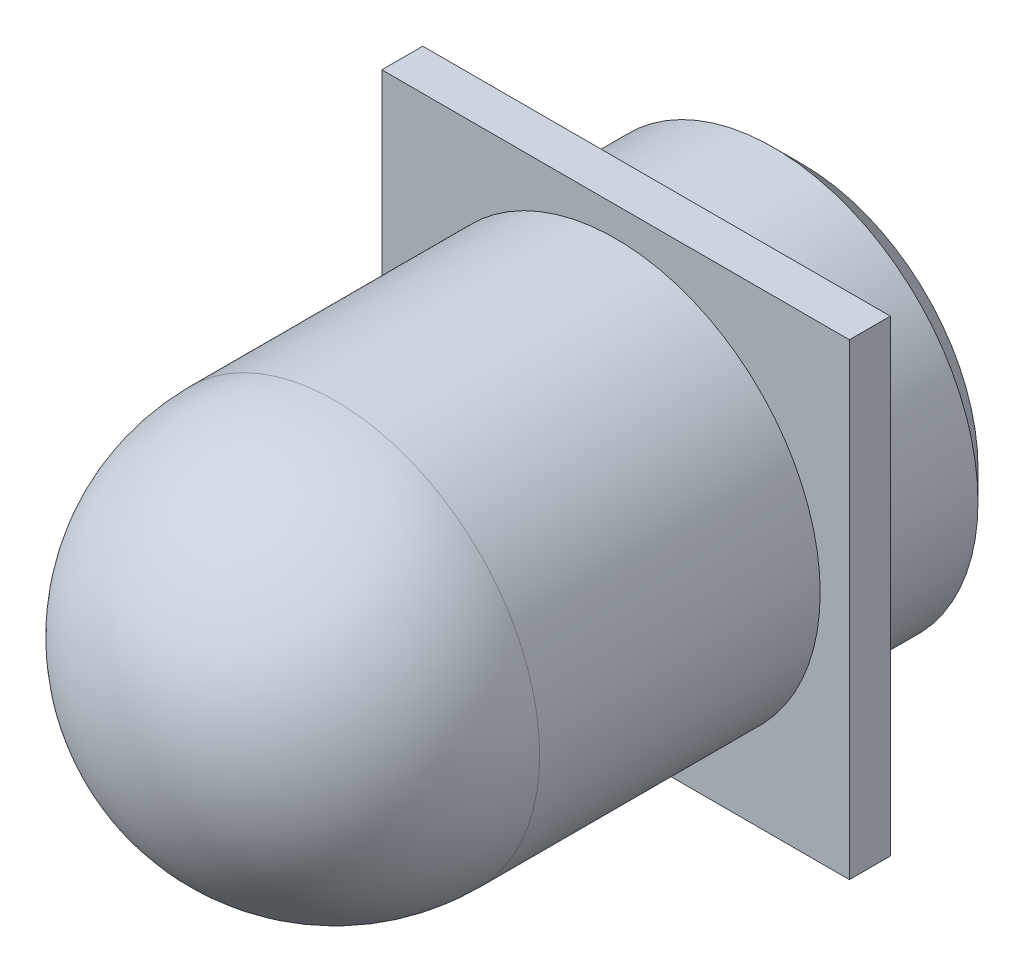
ISO-10303-21;
HEADER;
FILE_DESCRIPTION(('STEP AP214'),'2;1');
FILE_NAME('part.step','',(''),(''),'','','');
FILE_SCHEMA(('AUTOMOTIVE_DESIGN { 1 0 10303 214 1 1 1 1 }'));
ENDSEC;
DATA;
#1=APPLICATION_CONTEXT('core data for automotive mechanical design processes');
#2=APPLICATION_PROTOCOL_DEFINITION('international standard','automotive_design',2000,#1);
#3=PRODUCT_CONTEXT('',#1,'mechanical');
#4=PRODUCT('Part','Part','',(#3));
#5=PRODUCT_RELATED_PRODUCT_CATEGORY('part','',(#4));
#6=PRODUCT_DEFINITION_FORMATION('','',#4);
#7=PRODUCT_DEFINITION_CONTEXT('part definition',#1,'design');
#8=PRODUCT_DEFINITION('design','',#6,#7);
#9=PRODUCT_DEFINITION_SHAPE('','',#8);
#10=(LENGTH_UNIT() NAMED_UNIT(*) SI_UNIT(.MILLI.,.METRE.));
#11=(NAMED_UNIT(*) PLANE_ANGLE_UNIT() SI_UNIT($,.RADIAN.));
#12=(NAMED_UNIT(*) SI_UNIT($,.STERADIAN.) SOLID_ANGLE_UNIT());
#13=UNCERTAINTY_MEASURE_WITH_UNIT(LENGTH_MEASURE(1.E-05),#10,'distance_accuracy_value','');
#14=(GEOMETRIC_REPRESENTATION_CONTEXT(3) GLOBAL_UNCERTAINTY_ASSIGNED_CONTEXT((#13)) GLOBAL_UNIT_ASSIGNED_CONTEXT((#10,
#11,#12)) REPRESENTATION_CONTEXT('',''));
#15=CARTESIAN_POINT('',(0.,0.,0.));
#16=DIRECTION('',(0.,0.,1.));
#17=DIRECTION('',(1.,0.,0.));
#18=AXIS2_PLACEMENT_3D('',#15,#16,#17);
#19=CARTESIAN_POINT('',(0.,0.,2.));
#20=DIRECTION('',(0.,0.,-1.));
#21=DIRECTION('',(-1.,0.,0.));
#22=AXIS2_PLACEMENT_3D('',#19,#20,#21);
#23=PLANE('',#22);
#24=CARTESIAN_POINT('',(0.,0.,2.));
#25=DIRECTION('',(0.,0.,-1.));
#26=DIRECTION('',(-1.,0.,0.));
#27=AXIS2_PLACEMENT_3D('',#24,#25,#26);
#28=CIRCLE('',#27,3.5);
#29=CARTESIAN_POINT('',(3.5,0.,2.));
#30=VERTEX_POINT('',#29);
#31=CARTESIAN_POINT('',(0.,-3.5,2.));
#32=VERTEX_POINT('',#31);
#33=EDGE_CURVE('E197',#30,#32,#28,.T.);
#34=ORIENTED_EDGE('',*,*,#33,.F.);
#35=DIRECTION('',(0.,-1.,0.));
#36=VECTOR('',#35,1.);
#37=CARTESIAN_POINT('',(3.5,0.,2.));
#38=LINE('',#37,#36);
#39=CARTESIAN_POINT('',(3.5,-3.5,2.));
#40=VERTEX_POINT('',#39);
#41=EDGE_CURVE('E163',#30,#40,#38,.T.);
#42=ORIENTED_EDGE('',*,*,#41,.T.);
#43=DIRECTION('',(-1.,0.,0.));
#44=VECTOR('',#43,1.);
#45=CARTESIAN_POINT('',(0.,-3.5,2.));
#46=LINE('',#45,#44);
#47=EDGE_CURVE('E160',#40,#32,#46,.T.);
#48=ORIENTED_EDGE('',*,*,#47,.T.);
#49=EDGE_LOOP('',(#34,#42,#48));
#50=FACE_BOUND('',#49,.T.);
#51=ADVANCED_FACE('F33',(#50),#23,.T.);
#52=CARTESIAN_POINT('',(-3.5,0.,2.));
#53=VERTEX_POINT('',#52);
#54=EDGE_CURVE('E128',#32,#53,#28,.T.);
#55=ORIENTED_EDGE('',*,*,#54,.F.);
#56=DIRECTION('',(-1.,0.,0.));
#57=VECTOR('',#56,1.);
#58=CARTESIAN_POINT('',(0.,-3.5,2.));
#59=LINE('',#58,#57);
#60=CARTESIAN_POINT('',(-3.5,-3.5,2.));
#61=VERTEX_POINT('',#60);
#62=EDGE_CURVE('E158',#32,#61,#59,.T.);
#63=ORIENTED_EDGE('',*,*,#62,.T.);
#64=DIRECTION('',(0.,1.,0.));
#65=VECTOR('',#64,1.);
#66=CARTESIAN_POINT('',(-3.5,0.,2.));
#67=LINE('',#66,#65);
#68=EDGE_CURVE('E156',#61,#53,#67,.T.);
#69=ORIENTED_EDGE('',*,*,#68,.T.);
#70=EDGE_LOOP('',(#55,#63,#69));
#71=FACE_BOUND('',#70,.T.);
#72=ADVANCED_FACE('F202',(#71),#23,.T.);
#73=CARTESIAN_POINT('',(0.,3.5,2.));
#74=VERTEX_POINT('',#73);
#75=EDGE_CURVE('E136',#53,#74,#28,.T.);
#76=ORIENTED_EDGE('',*,*,#75,.F.);
#77=DIRECTION('',(0.,1.,0.));
#78=VECTOR('',#77,1.);
#79=CARTESIAN_POINT('',(-3.5,0.,2.));
#80=LINE('',#79,#78);
#81=CARTESIAN_POINT('',(-3.5,3.5,2.));
#82=VERTEX_POINT('',#81);
#83=EDGE_CURVE('E154',#53,#82,#80,.T.);
#84=ORIENTED_EDGE('',*,*,#83,.T.);
#85=DIRECTION('',(1.,0.,0.));
#86=VECTOR('',#85,1.);
#87=CARTESIAN_POINT('',(0.,3.5,2.));
#88=LINE('',#87,#86);
#89=EDGE_CURVE('E150',#82,#74,#88,.T.);
#90=ORIENTED_EDGE('',*,*,#89,.T.);
#91=EDGE_LOOP('',(#76,#84,#90));
#92=FACE_BOUND('',#91,.T.);
#93=ADVANCED_FACE('F188',(#92),#23,.T.);
#94=CARTESIAN_POINT('',(0.,0.,11.5));
#95=DIRECTION('',(0.,0.,-1.));
#96=DIRECTION('',(-1.,0.,0.));
#97=AXIS2_PLACEMENT_3D('',#94,#95,#96);
#98=CYLINDRICAL_SURFACE('',#97,3.5);
#99=CARTESIAN_POINT('',(0.,0.,8.));
#100=DIRECTION('',(0.,0.,-1.));
#101=DIRECTION('',(-1.,0.,0.));
#102=AXIS2_PLACEMENT_3D('',#99,#100,#101);
#103=CIRCLE('',#102,3.5);
#104=CARTESIAN_POINT('',(-3.5,0.,8.));
#105=VERTEX_POINT('',#104);
#106=EDGE_CURVE('E132',#105,#105,#103,.T.);
#107=ORIENTED_EDGE('',*,*,#106,.T.);
#108=EDGE_LOOP('',(#107));
#109=FACE_BOUND('',#108,.T.);
#110=CARTESIAN_POINT('',(0.,0.,3.2));
#111=DIRECTION('',(0.,0.,-1.));
#112=DIRECTION('',(-1.,0.,0.));
#113=AXIS2_PLACEMENT_3D('',#110,#111,#112);
#114=CIRCLE('',#113,3.5);
#115=CARTESIAN_POINT('',(-3.5,0.,3.2));
#116=VERTEX_POINT('',#115);
#117=EDGE_CURVE('E135',#116,#116,#114,.T.);
#118=ORIENTED_EDGE('',*,*,#117,.F.);
#119=EDGE_LOOP('',(#118));
#120=FACE_BOUND('',#119,.T.);
#121=ADVANCED_FACE('F230',(#109,#120),#98,.T.);
#122=CARTESIAN_POINT('',(0.,0.,8.));
#123=DIRECTION('',(0.,0.,1.));
#124=DIRECTION('',(1.,0.,0.));
#125=AXIS2_PLACEMENT_3D('',#122,#123,#124);
#126=SPHERICAL_SURFACE('',#125,3.5);
#127=ORIENTED_EDGE('',*,*,#106,.F.);
#128=EDGE_LOOP('',(#127));
#129=FACE_BOUND('',#128,.T.);
#130=ADVANCED_FACE('F235',(#129),#126,.T.);
#131=CARTESIAN_POINT('',(4.,-4.,3.2));
#132=DIRECTION('',(1.,0.,0.));
#133=DIRECTION('',(0.,0.,-1.));
#134=AXIS2_PLACEMENT_3D('',#131,#132,#133);
#135=PLANE('',#134);
#136=DIRECTION('',(0.,0.,-1.));
#137=VECTOR('',#136,1.);
#138=CARTESIAN_POINT('',(4.,-4.,3.2));
#139=LINE('',#138,#137);
#140=CARTESIAN_POINT('',(4.,-4.,3.2));
#141=VERTEX_POINT('',#140);
#142=CARTESIAN_POINT('',(4.,-4.,2.5));
#143=VERTEX_POINT('',#142);
#144=EDGE_CURVE('E98',#141,#143,#139,.T.);
#145=ORIENTED_EDGE('',*,*,#144,.T.);
#146=DIRECTION('',(0.,1.,0.));
#147=VECTOR('',#146,1.);
#148=CARTESIAN_POINT('',(4.,-4.,2.5));
#149=LINE('',#148,#147);
#150=CARTESIAN_POINT('',(4.,4.,2.5));
#151=VERTEX_POINT('',#150);
#152=EDGE_CURVE('E42',#143,#151,#149,.T.);
#153=ORIENTED_EDGE('',*,*,#152,.T.);
#154=DIRECTION('',(0.,0.,-1.));
#155=VECTOR('',#154,1.);
#156=CARTESIAN_POINT('',(4.,4.,3.2));
#157=LINE('',#156,#155);
#158=CARTESIAN_POINT('',(4.,4.,3.2));
#159=VERTEX_POINT('',#158);
#160=EDGE_CURVE('E120',#159,#151,#157,.T.);
#161=ORIENTED_EDGE('',*,*,#160,.F.);
#162=DIRECTION('',(0.,-1.,0.));
#163=VECTOR('',#162,1.);
#164=CARTESIAN_POINT('',(4.,-4.,3.2));
#165=LINE('',#164,#163);
#166=EDGE_CURVE('E114',#159,#141,#165,.T.);
#167=ORIENTED_EDGE('',*,*,#166,.T.);
#168=EDGE_LOOP('',(#145,#153,#161,#167));
#169=FACE_BOUND('',#168,.T.);
#170=ADVANCED_FACE('F119',(#169),#135,.T.);
#171=CARTESIAN_POINT('',(-4.,4.,3.2));
#172=DIRECTION('',(0.,1.,0.));
#173=DIRECTION('',(-1.,0.,0.));
#174=AXIS2_PLACEMENT_3D('',#171,#172,#173);
#175=PLANE('',#174);
#176=ORIENTED_EDGE('',*,*,#160,.T.);
#177=DIRECTION('',(-1.,0.,0.));
#178=VECTOR('',#177,1.);
#179=CARTESIAN_POINT('',(-4.,4.,2.5));
#180=LINE('',#179,#178);
#181=CARTESIAN_POINT('',(-4.,4.,2.5));
#182=VERTEX_POINT('',#181);
#183=EDGE_CURVE('E11',#151,#182,#180,.T.);
#184=ORIENTED_EDGE('',*,*,#183,.T.);
#185=DIRECTION('',(0.,0.,-1.));
#186=VECTOR('',#185,1.);
#187=CARTESIAN_POINT('',(-4.,4.,3.2));
#188=LINE('',#187,#186);
#189=CARTESIAN_POINT('',(-4.,4.,3.2));
#190=VERTEX_POINT('',#189);
#191=EDGE_CURVE('E129',#190,#182,#188,.T.);
#192=ORIENTED_EDGE('',*,*,#191,.F.);
#193=DIRECTION('',(1.,0.,0.));
#194=VECTOR('',#193,1.);
#195=CARTESIAN_POINT('',(-4.,4.,3.2));
#196=LINE('',#195,#194);
#197=EDGE_CURVE('E107',#190,#159,#196,.T.);
#198=ORIENTED_EDGE('',*,*,#197,.T.);
#199=EDGE_LOOP('',(#176,#184,#192,#198));
#200=FACE_BOUND('',#199,.T.);
#201=ADVANCED_FACE('F325',(#200),#175,.T.);
#202=CARTESIAN_POINT('',(-4.,-4.,3.2));
#203=DIRECTION('',(-1.,0.,0.));
#204=DIRECTION('',(0.,0.,1.));
#205=AXIS2_PLACEMENT_3D('',#202,#203,#204);
#206=PLANE('',#205);
#207=ORIENTED_EDGE('',*,*,#191,.T.);
#208=DIRECTION('',(0.,-1.,0.));
#209=VECTOR('',#208,1.);
#210=CARTESIAN_POINT('',(-4.,-4.,2.5));
#211=LINE('',#210,#209);
#212=CARTESIAN_POINT('',(-4.,-4.,2.5));
#213=VERTEX_POINT('',#212);
#214=EDGE_CURVE('E166',#182,#213,#211,.T.);
#215=ORIENTED_EDGE('',*,*,#214,.T.);
#216=DIRECTION('',(0.,0.,-1.));
#217=VECTOR('',#216,1.);
#218=CARTESIAN_POINT('',(-4.,-4.,3.2));
#219=LINE('',#218,#217);
#220=CARTESIAN_POINT('',(-4.,-4.,3.2));
#221=VERTEX_POINT('',#220);
#222=EDGE_CURVE('E106',#221,#213,#219,.T.);
#223=ORIENTED_EDGE('',*,*,#222,.F.);
#224=DIRECTION('',(0.,1.,0.));
#225=VECTOR('',#224,1.);
#226=CARTESIAN_POINT('',(-4.,-4.,3.2));
#227=LINE('',#226,#225);
#228=EDGE_CURVE('E117',#221,#190,#227,.T.);
#229=ORIENTED_EDGE('',*,*,#228,.T.);
#230=EDGE_LOOP('',(#207,#215,#223,#229));
#231=FACE_BOUND('',#230,.T.);
#232=ADVANCED_FACE('F317',(#231),#206,.T.);
#233=CARTESIAN_POINT('',(-4.,-4.,3.2));
#234=DIRECTION('',(0.,-1.,0.));
#235=DIRECTION('',(1.,0.,0.));
#236=AXIS2_PLACEMENT_3D('',#233,#234,#235);
#237=PLANE('',#236);
#238=ORIENTED_EDGE('',*,*,#222,.T.);
#239=DIRECTION('',(1.,0.,0.));
#240=VECTOR('',#239,1.);
#241=CARTESIAN_POINT('',(-4.,-4.,2.5));
#242=LINE('',#241,#240);
#243=EDGE_CURVE('E104',#213,#143,#242,.T.);
#244=ORIENTED_EDGE('',*,*,#243,.T.);
#245=ORIENTED_EDGE('',*,*,#144,.F.);
#246=DIRECTION('',(-1.,0.,0.));
#247=VECTOR('',#246,1.);
#248=CARTESIAN_POINT('',(-4.,-4.,3.2));
#249=LINE('',#248,#247);
#250=EDGE_CURVE('E102',#141,#221,#249,.T.);
#251=ORIENTED_EDGE('',*,*,#250,.T.);
#252=EDGE_LOOP('',(#238,#244,#245,#251));
#253=FACE_BOUND('',#252,.T.);
#254=ADVANCED_FACE('F101',(#253),#237,.T.);
#255=CARTESIAN_POINT('',(0.,0.,3.2));
#256=DIRECTION('',(0.,0.,-1.));
#257=DIRECTION('',(-1.,0.,0.));
#258=AXIS2_PLACEMENT_3D('',#255,#256,#257);
#259=PLANE('',#258);
#260=ORIENTED_EDGE('',*,*,#117,.T.);
#261=EDGE_LOOP('',(#260));
#262=FACE_BOUND('',#261,.T.);
#263=ORIENTED_EDGE('',*,*,#166,.F.);
#264=ORIENTED_EDGE('',*,*,#197,.F.);
#265=ORIENTED_EDGE('',*,*,#228,.F.);
#266=ORIENTED_EDGE('',*,*,#250,.F.);
#267=EDGE_LOOP('',(#263,#264,#265,#266));
#268=FACE_BOUND('',#267,.T.);
#269=ADVANCED_FACE('F112',(#262,#268),#259,.F.);
#270=DIRECTION('',(1.,0.,0.));
#271=VECTOR('',#270,1.);
#272=CARTESIAN_POINT('',(0.,3.5,2.));
#273=LINE('',#272,#271);
#274=CARTESIAN_POINT('',(3.5,3.5,2.));
#275=VERTEX_POINT('',#274);
#276=EDGE_CURVE('E148',#74,#275,#273,.T.);
#277=ORIENTED_EDGE('',*,*,#276,.T.);
#278=DIRECTION('',(0.,-1.,0.));
#279=VECTOR('',#278,1.);
#280=CARTESIAN_POINT('',(3.5,0.,2.));
#281=LINE('',#280,#279);
#282=EDGE_CURVE('E152',#275,#30,#281,.T.);
#283=ORIENTED_EDGE('',*,*,#282,.T.);
#284=EDGE_CURVE('E139',#74,#30,#28,.T.);
#285=ORIENTED_EDGE('',*,*,#284,.F.);
#286=EDGE_LOOP('',(#277,#283,#285));
#287=FACE_BOUND('',#286,.T.);
#288=ADVANCED_FACE('F191',(#287),#23,.T.);
#289=CARTESIAN_POINT('',(0.,0.,0.));
#290=DIRECTION('',(0.,0.,1.));
#291=DIRECTION('',(1.,0.,0.));
#292=AXIS2_PLACEMENT_3D('',#289,#290,#291);
#293=PLANE('',#292);
#294=CARTESIAN_POINT('',(0.,0.,0.));
#295=DIRECTION('',(0.,0.,1.));
#296=DIRECTION('',(1.,0.,0.));
#297=AXIS2_PLACEMENT_3D('',#294,#295,#296);
#298=CIRCLE('',#297,3.);
#299=CARTESIAN_POINT('',(3.,0.,0.));
#300=VERTEX_POINT('',#299);
#301=EDGE_CURVE('E145',#300,#300,#298,.F.);
#302=ORIENTED_EDGE('',*,*,#301,.T.);
#303=EDGE_LOOP('',(#302));
#304=FACE_BOUND('',#303,.T.);
#305=ADVANCED_FACE('F219',(#304),#293,.F.);
#306=CARTESIAN_POINT('',(0.,0.,0.499999999999997));
#307=DIRECTION('',(0.,0.,1.));
#308=DIRECTION('',(1.,0.,0.));
#309=AXIS2_PLACEMENT_3D('',#306,#307,#308);
#310=CIRCLE('',#309,3.5);
#311=CARTESIAN_POINT('',(3.5,0.,0.499999999999997));
#312=VERTEX_POINT('',#311);
#313=EDGE_CURVE('E142',#312,#312,#310,.T.);
#314=ORIENTED_EDGE('',*,*,#313,.T.);
#315=EDGE_LOOP('',(#314));
#316=FACE_BOUND('',#315,.T.);
#317=ORIENTED_EDGE('',*,*,#75,.T.);
#318=ORIENTED_EDGE('',*,*,#284,.T.);
#319=ORIENTED_EDGE('',*,*,#33,.T.);
#320=ORIENTED_EDGE('',*,*,#54,.T.);
#321=EDGE_LOOP('',(#317,#318,#319,#320));
#322=FACE_BOUND('',#321,.T.);
#323=ADVANCED_FACE('F199',(#316,#322),#98,.T.);
#324=CARTESIAN_POINT('',(0.,0.,0.499999999999997));
#325=DIRECTION('',(0.,0.,1.));
#326=DIRECTION('',(1.,0.,0.));
#327=AXIS2_PLACEMENT_3D('',#324,#325,#326);
#328=CONICAL_SURFACE('',#327,3.5,0.785398163397451);
#329=ORIENTED_EDGE('',*,*,#301,.F.);
#330=EDGE_LOOP('',(#329));
#331=FACE_BOUND('',#330,.T.);
#332=ORIENTED_EDGE('',*,*,#313,.F.);
#333=EDGE_LOOP('',(#332));
#334=FACE_BOUND('',#333,.T.);
#335=ADVANCED_FACE('F244',(#331,#334),#328,.T.);
#336=CARTESIAN_POINT('',(0.,3.5,2.));
#337=DIRECTION('',(0.,-0.707106781186546,0.707106781186549));
#338=DIRECTION('',(1.,0.,0.));
#339=AXIS2_PLACEMENT_3D('',#336,#337,#338);
#340=PLANE('',#339);
#341=DIRECTION('',(-0.577350269189626,0.577350269189626,0.577350269189624));
#342=VECTOR('',#341,1.);
#343=CARTESIAN_POINT('',(-2.33333333333333,2.33333333333333,0.833333333333335));
#344=LINE('',#343,#342);
#345=EDGE_CURVE('E123',#182,#82,#344,.F.);
#346=ORIENTED_EDGE('',*,*,#345,.F.);
#347=ORIENTED_EDGE('',*,*,#183,.F.);
#348=DIRECTION('',(-0.577350269189626,-0.577350269189626,-0.577350269189624));
#349=VECTOR('',#348,1.);
#350=CARTESIAN_POINT('',(2.33333333333333,2.33333333333333,0.833333333333334));
#351=LINE('',#350,#349);
#352=EDGE_CURVE('E37',#275,#151,#351,.F.);
#353=ORIENTED_EDGE('',*,*,#352,.F.);
#354=ORIENTED_EDGE('',*,*,#276,.F.);
#355=ORIENTED_EDGE('',*,*,#89,.F.);
#356=EDGE_LOOP('',(#346,#347,#353,#354,#355));
#357=FACE_BOUND('',#356,.T.);
#358=ADVANCED_FACE('F35',(#357),#340,.F.);
#359=CARTESIAN_POINT('',(3.5,0.,2.));
#360=DIRECTION('',(-0.707106781186546,0.,0.707106781186549));
#361=DIRECTION('',(0.,-1.,0.));
#362=AXIS2_PLACEMENT_3D('',#359,#360,#361);
#363=PLANE('',#362);
#364=ORIENTED_EDGE('',*,*,#352,.T.);
#365=ORIENTED_EDGE('',*,*,#152,.F.);
#366=DIRECTION('',(-0.577350269189626,0.577350269189627,-0.577350269189624));
#367=VECTOR('',#366,1.);
#368=CARTESIAN_POINT('',(2.33333333333333,-2.33333333333333,0.833333333333334));
#369=LINE('',#368,#367);
#370=EDGE_CURVE('E172',#40,#143,#369,.F.);
#371=ORIENTED_EDGE('',*,*,#370,.F.);
#372=ORIENTED_EDGE('',*,*,#41,.F.);
#373=ORIENTED_EDGE('',*,*,#282,.F.);
#374=EDGE_LOOP('',(#364,#365,#371,#372,#373));
#375=FACE_BOUND('',#374,.T.);
#376=ADVANCED_FACE('F208',(#375),#363,.F.);
#377=CARTESIAN_POINT('',(-3.5,0.,2.));
#378=DIRECTION('',(0.707106781186546,0.,0.707106781186549));
#379=DIRECTION('',(0.,1.,0.));
#380=AXIS2_PLACEMENT_3D('',#377,#378,#379);
#381=PLANE('',#380);
#382=ORIENTED_EDGE('',*,*,#83,.F.);
#383=ORIENTED_EDGE('',*,*,#68,.F.);
#384=DIRECTION('',(-0.577350269189627,-0.577350269189626,0.577350269189625));
#385=VECTOR('',#384,1.);
#386=CARTESIAN_POINT('',(-2.33333333333333,-2.33333333333333,0.833333333333334));
#387=LINE('',#386,#385);
#388=EDGE_CURVE('E169',#213,#61,#387,.F.);
#389=ORIENTED_EDGE('',*,*,#388,.F.);
#390=ORIENTED_EDGE('',*,*,#214,.F.);
#391=ORIENTED_EDGE('',*,*,#345,.T.);
#392=EDGE_LOOP('',(#382,#383,#389,#390,#391));
#393=FACE_BOUND('',#392,.T.);
#394=ADVANCED_FACE('F178',(#393),#381,.F.);
#395=CARTESIAN_POINT('',(0.,-3.5,2.));
#396=DIRECTION('',(0.,0.707106781186546,0.707106781186549));
#397=DIRECTION('',(-1.,0.,0.));
#398=AXIS2_PLACEMENT_3D('',#395,#396,#397);
#399=PLANE('',#398);
#400=ORIENTED_EDGE('',*,*,#370,.T.);
#401=ORIENTED_EDGE('',*,*,#243,.F.);
#402=ORIENTED_EDGE('',*,*,#388,.T.);
#403=ORIENTED_EDGE('',*,*,#62,.F.);
#404=ORIENTED_EDGE('',*,*,#47,.F.);
#405=EDGE_LOOP('',(#400,#401,#402,#403,#404));
#406=FACE_BOUND('',#405,.T.);
#407=ADVANCED_FACE('F204',(#406),#399,.F.);
#408=CLOSED_SHELL('',(#51,#72,#93,#121,#130,#170,#201,#232,#254,#269,#288,#305,#323,#335,#358,
#376,#394,#407));
#409=MANIFOLD_SOLID_BREP('B2',#408);
#410=ADVANCED_BREP_SHAPE_REPRESENTATION('',(#18,#409),#14);
#411=SHAPE_DEFINITION_REPRESENTATION(#9,#410);
ENDSEC;
END-ISO-10303-21;
